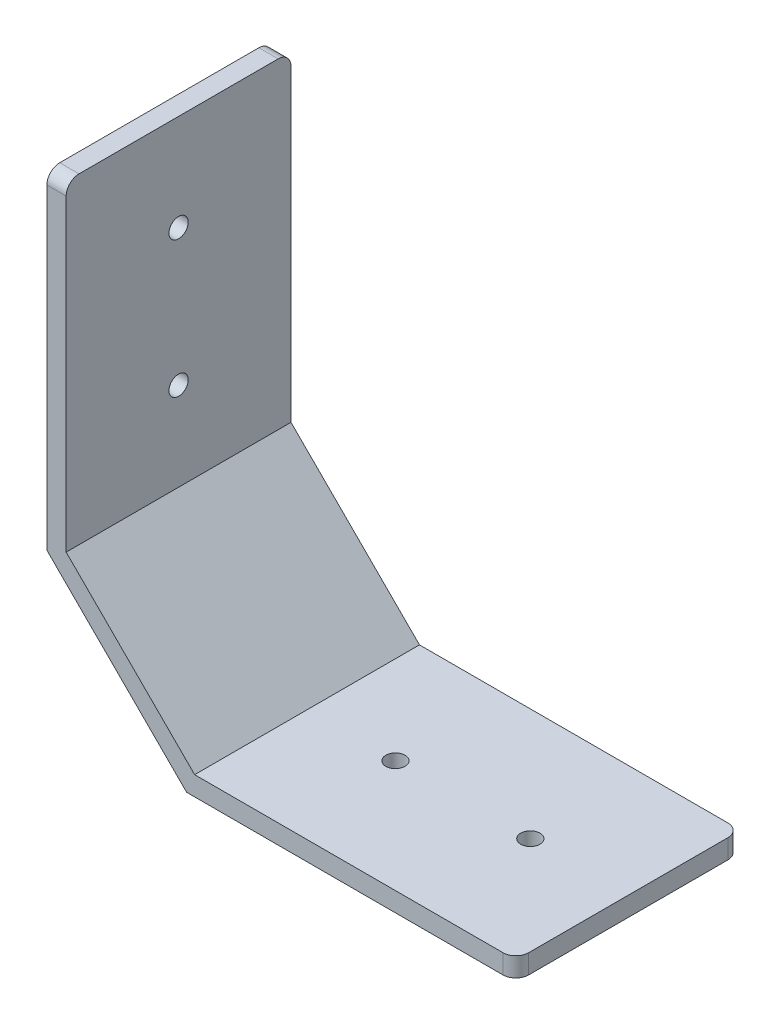
ISO-10303-21;
HEADER;
FILE_DESCRIPTION(('STEP AP214'),'2;1');
FILE_NAME('part.step','',(''),(''),'','','');
FILE_SCHEMA(('AUTOMOTIVE_DESIGN { 1 0 10303 214 1 1 1 1 }'));
ENDSEC;
DATA;
#1=APPLICATION_CONTEXT('core data for automotive mechanical design processes');
#2=APPLICATION_PROTOCOL_DEFINITION('international standard','automotive_design',2000,#1);
#3=PRODUCT_CONTEXT('',#1,'mechanical');
#4=PRODUCT('Part','Part','',(#3));
#5=PRODUCT_RELATED_PRODUCT_CATEGORY('part','',(#4));
#6=PRODUCT_DEFINITION_FORMATION('','',#4);
#7=PRODUCT_DEFINITION_CONTEXT('part definition',#1,'design');
#8=PRODUCT_DEFINITION('design','',#6,#7);
#9=PRODUCT_DEFINITION_SHAPE('','',#8);
#10=(LENGTH_UNIT() NAMED_UNIT(*) SI_UNIT(.MILLI.,.METRE.));
#11=(NAMED_UNIT(*) PLANE_ANGLE_UNIT() SI_UNIT($,.RADIAN.));
#12=(NAMED_UNIT(*) SI_UNIT($,.STERADIAN.) SOLID_ANGLE_UNIT());
#13=UNCERTAINTY_MEASURE_WITH_UNIT(LENGTH_MEASURE(1.E-05),#10,'distance_accuracy_value','');
#14=(GEOMETRIC_REPRESENTATION_CONTEXT(3) GLOBAL_UNCERTAINTY_ASSIGNED_CONTEXT((#13)) GLOBAL_UNIT_ASSIGNED_CONTEXT((#10,
#11,#12)) REPRESENTATION_CONTEXT('',''));
#15=CARTESIAN_POINT('',(0.,0.,0.));
#16=DIRECTION('',(0.,0.,1.));
#17=DIRECTION('',(1.,0.,0.));
#18=AXIS2_PLACEMENT_3D('',#15,#16,#17);
#19=CARTESIAN_POINT('',(20.,-23.,35.));
#20=DIRECTION('',(0.,1.,0.));
#21=DIRECTION('',(0.,0.,1.));
#22=AXIS2_PLACEMENT_3D('',#19,#20,#21);
#23=PLANE('',#22);
#24=CARTESIAN_POINT('',(54.7573593128807,-23.,17.5));
#25=DIRECTION('',(0.,-1.,0.));
#26=DIRECTION('',(0.,0.,-1.));
#27=AXIS2_PLACEMENT_3D('',#24,#25,#26);
#28=CIRCLE('',#27,1.5);
#29=CARTESIAN_POINT('',(54.7573593128807,-23.,16.));
#30=VERTEX_POINT('',#29);
#31=EDGE_CURVE('E226',#30,#30,#28,.T.);
#32=ORIENTED_EDGE('',*,*,#31,.F.);
#33=EDGE_LOOP('',(#32));
#34=FACE_BOUND('',#33,.T.);
#35=CARTESIAN_POINT('',(33.7573593128807,-23.,17.5));
#36=DIRECTION('',(0.,-1.,0.));
#37=DIRECTION('',(0.,0.,-1.));
#38=AXIS2_PLACEMENT_3D('',#35,#36,#37);
#39=CIRCLE('',#38,1.5);
#40=CARTESIAN_POINT('',(33.7573593128807,-23.,16.));
#41=VERTEX_POINT('',#40);
#42=EDGE_CURVE('E218',#41,#41,#39,.T.);
#43=ORIENTED_EDGE('',*,*,#42,.F.);
#44=EDGE_LOOP('',(#43));
#45=FACE_BOUND('',#44,.T.);
#46=DIRECTION('',(1.,0.,0.));
#47=VECTOR('',#46,1.);
#48=CARTESIAN_POINT('',(20.,-23.,0.));
#49=LINE('',#48,#47);
#50=CARTESIAN_POINT('',(18.7573593128807,-23.,0.));
#51=VERTEX_POINT('',#50);
#52=CARTESIAN_POINT('',(68.,-23.,0.));
#53=VERTEX_POINT('',#52);
#54=EDGE_CURVE('E160',#51,#53,#49,.T.);
#55=ORIENTED_EDGE('',*,*,#54,.T.);
#56=CARTESIAN_POINT('',(68.,-23.,2.));
#57=DIRECTION('',(0.,1.,0.));
#58=DIRECTION('',(0.,0.,1.));
#59=AXIS2_PLACEMENT_3D('',#56,#57,#58);
#60=CIRCLE('',#59,2.);
#61=CARTESIAN_POINT('',(70.,-23.,2.));
#62=VERTEX_POINT('',#61);
#63=EDGE_CURVE('E56',#53,#62,#60,.F.);
#64=ORIENTED_EDGE('',*,*,#63,.T.);
#65=DIRECTION('',(0.,0.,-1.));
#66=VECTOR('',#65,1.);
#67=CARTESIAN_POINT('',(70.,-23.,35.));
#68=LINE('',#67,#66);
#69=CARTESIAN_POINT('',(70.,-23.,33.));
#70=VERTEX_POINT('',#69);
#71=EDGE_CURVE('E185',#70,#62,#68,.T.);
#72=ORIENTED_EDGE('',*,*,#71,.F.);
#73=CARTESIAN_POINT('',(68.,-23.,33.));
#74=DIRECTION('',(0.,1.,0.));
#75=DIRECTION('',(0.,0.,1.));
#76=AXIS2_PLACEMENT_3D('',#73,#74,#75);
#77=CIRCLE('',#76,2.);
#78=CARTESIAN_POINT('',(68.,-23.,35.));
#79=VERTEX_POINT('',#78);
#80=EDGE_CURVE('E208',#70,#79,#77,.F.);
#81=ORIENTED_EDGE('',*,*,#80,.T.);
#82=DIRECTION('',(1.,0.,0.));
#83=VECTOR('',#82,1.);
#84=CARTESIAN_POINT('',(20.,-23.,35.));
#85=LINE('',#84,#83);
#86=CARTESIAN_POINT('',(18.7573593128807,-23.,35.));
#87=VERTEX_POINT('',#86);
#88=EDGE_CURVE('E145',#87,#79,#85,.T.);
#89=ORIENTED_EDGE('',*,*,#88,.F.);
#90=DIRECTION('',(0.,0.,-1.));
#91=VECTOR('',#90,1.);
#92=CARTESIAN_POINT('',(18.7573593128807,-23.,35.));
#93=LINE('',#92,#91);
#94=EDGE_CURVE('E159',#87,#51,#93,.T.);
#95=ORIENTED_EDGE('',*,*,#94,.T.);
#96=EDGE_LOOP('',(#55,#64,#72,#81,#89,#95));
#97=FACE_BOUND('',#96,.T.);
#98=ADVANCED_FACE('F32',(#34,#45,#97),#23,.F.);
#99=CARTESIAN_POINT('',(70.,-20.,35.));
#100=DIRECTION('',(1.,0.,0.));
#101=DIRECTION('',(0.,0.,-1.));
#102=AXIS2_PLACEMENT_3D('',#99,#100,#101);
#103=PLANE('',#102);
#104=ORIENTED_EDGE('',*,*,#71,.T.);
#105=DIRECTION('',(0.,-1.,0.));
#106=VECTOR('',#105,1.);
#107=CARTESIAN_POINT('',(70.,-20.,2.));
#108=LINE('',#107,#106);
#109=CARTESIAN_POINT('',(70.,-20.,2.));
#110=VERTEX_POINT('',#109);
#111=EDGE_CURVE('E41',#62,#110,#108,.F.);
#112=ORIENTED_EDGE('',*,*,#111,.T.);
#113=DIRECTION('',(0.,0.,-1.));
#114=VECTOR('',#113,1.);
#115=CARTESIAN_POINT('',(70.,-20.,35.));
#116=LINE('',#115,#114);
#117=CARTESIAN_POINT('',(70.,-20.,33.));
#118=VERTEX_POINT('',#117);
#119=EDGE_CURVE('E134',#118,#110,#116,.T.);
#120=ORIENTED_EDGE('',*,*,#119,.F.);
#121=DIRECTION('',(0.,-1.,0.));
#122=VECTOR('',#121,1.);
#123=CARTESIAN_POINT('',(70.,-23.,33.));
#124=LINE('',#123,#122);
#125=EDGE_CURVE('E205',#118,#70,#124,.T.);
#126=ORIENTED_EDGE('',*,*,#125,.T.);
#127=EDGE_LOOP('',(#104,#112,#120,#126));
#128=FACE_BOUND('',#127,.T.);
#129=ADVANCED_FACE('F236',(#128),#103,.T.);
#130=CARTESIAN_POINT('',(20.,-20.,35.));
#131=DIRECTION('',(0.,1.,0.));
#132=DIRECTION('',(0.,0.,1.));
#133=AXIS2_PLACEMENT_3D('',#130,#131,#132);
#134=PLANE('',#133);
#135=CARTESIAN_POINT('',(54.7573593128807,-20.,17.5));
#136=DIRECTION('',(0.,1.,0.));
#137=DIRECTION('',(0.,0.,1.));
#138=AXIS2_PLACEMENT_3D('',#135,#136,#137);
#139=CIRCLE('',#138,1.5);
#140=CARTESIAN_POINT('',(54.7573593128807,-20.,19.));
#141=VERTEX_POINT('',#140);
#142=EDGE_CURVE('E36',#141,#141,#139,.T.);
#143=ORIENTED_EDGE('',*,*,#142,.F.);
#144=EDGE_LOOP('',(#143));
#145=FACE_BOUND('',#144,.T.);
#146=CARTESIAN_POINT('',(33.7573593128807,-20.,17.5));
#147=DIRECTION('',(0.,1.,0.));
#148=DIRECTION('',(0.,0.,1.));
#149=AXIS2_PLACEMENT_3D('',#146,#147,#148);
#150=CIRCLE('',#149,1.5);
#151=CARTESIAN_POINT('',(33.7573593128807,-20.,19.));
#152=VERTEX_POINT('',#151);
#153=EDGE_CURVE('E162',#152,#152,#150,.T.);
#154=ORIENTED_EDGE('',*,*,#153,.F.);
#155=EDGE_LOOP('',(#154));
#156=FACE_BOUND('',#155,.T.);
#157=ORIENTED_EDGE('',*,*,#119,.T.);
#158=CARTESIAN_POINT('',(68.,-20.,2.));
#159=DIRECTION('',(0.,1.,0.));
#160=DIRECTION('',(0.,0.,1.));
#161=AXIS2_PLACEMENT_3D('',#158,#159,#160);
#162=CIRCLE('',#161,2.);
#163=CARTESIAN_POINT('',(68.,-20.,0.));
#164=VERTEX_POINT('',#163);
#165=EDGE_CURVE('E11',#110,#164,#162,.T.);
#166=ORIENTED_EDGE('',*,*,#165,.T.);
#167=DIRECTION('',(1.,0.,0.));
#168=VECTOR('',#167,1.);
#169=CARTESIAN_POINT('',(20.,-20.,0.));
#170=LINE('',#169,#168);
#171=CARTESIAN_POINT('',(20.,-20.,0.));
#172=VERTEX_POINT('',#171);
#173=EDGE_CURVE('E129',#172,#164,#170,.T.);
#174=ORIENTED_EDGE('',*,*,#173,.F.);
#175=DIRECTION('',(0.,0.,-1.));
#176=VECTOR('',#175,1.);
#177=CARTESIAN_POINT('',(20.,-20.,35.));
#178=LINE('',#177,#176);
#179=CARTESIAN_POINT('',(20.,-20.,35.));
#180=VERTEX_POINT('',#179);
#181=EDGE_CURVE('E123',#180,#172,#178,.T.);
#182=ORIENTED_EDGE('',*,*,#181,.F.);
#183=DIRECTION('',(1.,0.,0.));
#184=VECTOR('',#183,1.);
#185=CARTESIAN_POINT('',(20.,-20.,35.));
#186=LINE('',#185,#184);
#187=CARTESIAN_POINT('',(68.,-20.,35.));
#188=VERTEX_POINT('',#187);
#189=EDGE_CURVE('E126',#180,#188,#186,.T.);
#190=ORIENTED_EDGE('',*,*,#189,.T.);
#191=CARTESIAN_POINT('',(68.,-20.,33.));
#192=DIRECTION('',(0.,1.,0.));
#193=DIRECTION('',(0.,0.,1.));
#194=AXIS2_PLACEMENT_3D('',#191,#192,#193);
#195=CIRCLE('',#194,2.);
#196=EDGE_CURVE('E211',#188,#118,#195,.T.);
#197=ORIENTED_EDGE('',*,*,#196,.T.);
#198=EDGE_LOOP('',(#157,#166,#174,#182,#190,#197));
#199=FACE_BOUND('',#198,.T.);
#200=ADVANCED_FACE('F125',(#145,#156,#199),#134,.T.);
#201=CARTESIAN_POINT('',(0.,0.,35.));
#202=DIRECTION('',(0.707106781186548,0.707106781186548,0.));
#203=DIRECTION('',(-0.707106781186548,0.707106781186547,0.));
#204=AXIS2_PLACEMENT_3D('',#201,#202,#203);
#205=PLANE('',#204);
#206=DIRECTION('',(0.707106781186548,-0.707106781186547,0.));
#207=VECTOR('',#206,1.);
#208=CARTESIAN_POINT('',(0.,0.,0.));
#209=LINE('',#208,#207);
#210=CARTESIAN_POINT('',(0.,0.,0.));
#211=VERTEX_POINT('',#210);
#212=EDGE_CURVE('E164',#211,#172,#209,.T.);
#213=ORIENTED_EDGE('',*,*,#212,.F.);
#214=DIRECTION('',(0.,0.,-1.));
#215=VECTOR('',#214,1.);
#216=CARTESIAN_POINT('',(0.,0.,35.));
#217=LINE('',#216,#215);
#218=CARTESIAN_POINT('',(0.,0.,35.));
#219=VERTEX_POINT('',#218);
#220=EDGE_CURVE('E135',#219,#211,#217,.T.);
#221=ORIENTED_EDGE('',*,*,#220,.F.);
#222=DIRECTION('',(0.707106781186548,-0.707106781186547,0.));
#223=VECTOR('',#222,1.);
#224=CARTESIAN_POINT('',(0.,0.,35.));
#225=LINE('',#224,#223);
#226=EDGE_CURVE('E142',#219,#180,#225,.T.);
#227=ORIENTED_EDGE('',*,*,#226,.T.);
#228=ORIENTED_EDGE('',*,*,#181,.T.);
#229=EDGE_LOOP('',(#213,#221,#227,#228));
#230=FACE_BOUND('',#229,.T.);
#231=ADVANCED_FACE('F148',(#230),#205,.T.);
#232=CARTESIAN_POINT('',(0.,0.,35.));
#233=DIRECTION('',(1.,0.,0.));
#234=DIRECTION('',(0.,0.,-1.));
#235=AXIS2_PLACEMENT_3D('',#232,#233,#234);
#236=PLANE('',#235);
#237=CARTESIAN_POINT('',(0.,13.7573593128807,17.5));
#238=DIRECTION('',(1.,0.,0.));
#239=DIRECTION('',(0.,0.,-1.));
#240=AXIS2_PLACEMENT_3D('',#237,#238,#239);
#241=CIRCLE('',#240,1.5);
#242=CARTESIAN_POINT('',(0.,13.7573593128807,16.));
#243=VERTEX_POINT('',#242);
#244=EDGE_CURVE('E326',#243,#243,#241,.T.);
#245=ORIENTED_EDGE('',*,*,#244,.F.);
#246=EDGE_LOOP('',(#245));
#247=FACE_BOUND('',#246,.T.);
#248=CARTESIAN_POINT('',(0.,35.,17.5));
#249=DIRECTION('',(1.,0.,0.));
#250=DIRECTION('',(0.,0.,-1.));
#251=AXIS2_PLACEMENT_3D('',#248,#249,#250);
#252=CIRCLE('',#251,1.5);
#253=CARTESIAN_POINT('',(0.,35.,16.));
#254=VERTEX_POINT('',#253);
#255=EDGE_CURVE('E320',#254,#254,#252,.T.);
#256=ORIENTED_EDGE('',*,*,#255,.F.);
#257=EDGE_LOOP('',(#256));
#258=FACE_BOUND('',#257,.T.);
#259=DIRECTION('',(0.,-1.,0.));
#260=VECTOR('',#259,1.);
#261=CARTESIAN_POINT('',(0.,0.,0.));
#262=LINE('',#261,#260);
#263=CARTESIAN_POINT('',(0.,48.,0.));
#264=VERTEX_POINT('',#263);
#265=EDGE_CURVE('E166',#264,#211,#262,.T.);
#266=ORIENTED_EDGE('',*,*,#265,.F.);
#267=CARTESIAN_POINT('',(0.,48.,2.));
#268=DIRECTION('',(1.,0.,0.));
#269=DIRECTION('',(0.,0.,-1.));
#270=AXIS2_PLACEMENT_3D('',#267,#268,#269);
#271=CIRCLE('',#270,2.);
#272=CARTESIAN_POINT('',(0.,50.,2.));
#273=VERTEX_POINT('',#272);
#274=EDGE_CURVE('E199',#264,#273,#271,.T.);
#275=ORIENTED_EDGE('',*,*,#274,.T.);
#276=DIRECTION('',(0.,0.,-1.));
#277=VECTOR('',#276,1.);
#278=CARTESIAN_POINT('',(0.,50.,35.));
#279=LINE('',#278,#277);
#280=CARTESIAN_POINT('',(0.,50.,33.));
#281=VERTEX_POINT('',#280);
#282=EDGE_CURVE('E180',#281,#273,#279,.T.);
#283=ORIENTED_EDGE('',*,*,#282,.F.);
#284=CARTESIAN_POINT('',(0.,48.,33.));
#285=DIRECTION('',(1.,0.,0.));
#286=DIRECTION('',(0.,0.,-1.));
#287=AXIS2_PLACEMENT_3D('',#284,#285,#286);
#288=CIRCLE('',#287,2.);
#289=CARTESIAN_POINT('',(0.,48.,35.));
#290=VERTEX_POINT('',#289);
#291=EDGE_CURVE('E190',#281,#290,#288,.T.);
#292=ORIENTED_EDGE('',*,*,#291,.T.);
#293=DIRECTION('',(0.,-1.,0.));
#294=VECTOR('',#293,1.);
#295=CARTESIAN_POINT('',(0.,0.,35.));
#296=LINE('',#295,#294);
#297=EDGE_CURVE('E150',#290,#219,#296,.T.);
#298=ORIENTED_EDGE('',*,*,#297,.T.);
#299=ORIENTED_EDGE('',*,*,#220,.T.);
#300=EDGE_LOOP('',(#266,#275,#283,#292,#298,#299));
#301=FACE_BOUND('',#300,.T.);
#302=ADVANCED_FACE('F274',(#247,#258,#301),#236,.T.);
#303=CARTESIAN_POINT('',(-3.,50.,35.));
#304=DIRECTION('',(0.,1.,0.));
#305=DIRECTION('',(0.,0.,1.));
#306=AXIS2_PLACEMENT_3D('',#303,#304,#305);
#307=PLANE('',#306);
#308=ORIENTED_EDGE('',*,*,#282,.T.);
#309=DIRECTION('',(1.,0.,0.));
#310=VECTOR('',#309,1.);
#311=CARTESIAN_POINT('',(-3.,50.,2.));
#312=LINE('',#311,#310);
#313=CARTESIAN_POINT('',(-3.,50.,2.));
#314=VERTEX_POINT('',#313);
#315=EDGE_CURVE('E201',#273,#314,#312,.F.);
#316=ORIENTED_EDGE('',*,*,#315,.T.);
#317=DIRECTION('',(0.,0.,-1.));
#318=VECTOR('',#317,1.);
#319=CARTESIAN_POINT('',(-3.,50.,35.));
#320=LINE('',#319,#318);
#321=CARTESIAN_POINT('',(-3.,50.,33.));
#322=VERTEX_POINT('',#321);
#323=EDGE_CURVE('E177',#322,#314,#320,.T.);
#324=ORIENTED_EDGE('',*,*,#323,.F.);
#325=DIRECTION('',(1.,0.,0.));
#326=VECTOR('',#325,1.);
#327=CARTESIAN_POINT('',(0.,50.,33.));
#328=LINE('',#327,#326);
#329=EDGE_CURVE('E187',#322,#281,#328,.T.);
#330=ORIENTED_EDGE('',*,*,#329,.T.);
#331=EDGE_LOOP('',(#308,#316,#324,#330));
#332=FACE_BOUND('',#331,.T.);
#333=ADVANCED_FACE('F286',(#332),#307,.T.);
#334=CARTESIAN_POINT('',(-3.,0.,35.));
#335=DIRECTION('',(1.,0.,0.));
#336=DIRECTION('',(0.,0.,-1.));
#337=AXIS2_PLACEMENT_3D('',#334,#335,#336);
#338=PLANE('',#337);
#339=CARTESIAN_POINT('',(-3.,13.7573593128807,17.5));
#340=DIRECTION('',(-1.,0.,0.));
#341=DIRECTION('',(0.,0.,1.));
#342=AXIS2_PLACEMENT_3D('',#339,#340,#341);
#343=CIRCLE('',#342,1.5);
#344=CARTESIAN_POINT('',(-3.,13.7573593128807,19.));
#345=VERTEX_POINT('',#344);
#346=EDGE_CURVE('E331',#345,#345,#343,.T.);
#347=ORIENTED_EDGE('',*,*,#346,.F.);
#348=EDGE_LOOP('',(#347));
#349=FACE_BOUND('',#348,.T.);
#350=CARTESIAN_POINT('',(-3.,35.,17.5));
#351=DIRECTION('',(-1.,0.,0.));
#352=DIRECTION('',(0.,0.,1.));
#353=AXIS2_PLACEMENT_3D('',#350,#351,#352);
#354=CIRCLE('',#353,1.5);
#355=CARTESIAN_POINT('',(-3.,35.,19.));
#356=VERTEX_POINT('',#355);
#357=EDGE_CURVE('E322',#356,#356,#354,.T.);
#358=ORIENTED_EDGE('',*,*,#357,.F.);
#359=EDGE_LOOP('',(#358));
#360=FACE_BOUND('',#359,.T.);
#361=ORIENTED_EDGE('',*,*,#323,.T.);
#362=CARTESIAN_POINT('',(-3.,48.,2.));
#363=DIRECTION('',(1.,0.,0.));
#364=DIRECTION('',(0.,0.,-1.));
#365=AXIS2_PLACEMENT_3D('',#362,#363,#364);
#366=CIRCLE('',#365,2.);
#367=CARTESIAN_POINT('',(-3.,48.,0.));
#368=VERTEX_POINT('',#367);
#369=EDGE_CURVE('E203',#314,#368,#366,.F.);
#370=ORIENTED_EDGE('',*,*,#369,.T.);
#371=DIRECTION('',(0.,1.,0.));
#372=VECTOR('',#371,1.);
#373=CARTESIAN_POINT('',(-3.,0.,0.));
#374=LINE('',#373,#372);
#375=CARTESIAN_POINT('',(-3.,-1.24264068711929,0.));
#376=VERTEX_POINT('',#375);
#377=EDGE_CURVE('E168',#368,#376,#374,.F.);
#378=ORIENTED_EDGE('',*,*,#377,.T.);
#379=DIRECTION('',(0.,0.,-1.));
#380=VECTOR('',#379,1.);
#381=CARTESIAN_POINT('',(-3.,-1.24264068711929,35.));
#382=LINE('',#381,#380);
#383=CARTESIAN_POINT('',(-3.,-1.24264068711929,35.));
#384=VERTEX_POINT('',#383);
#385=EDGE_CURVE('E174',#384,#376,#382,.T.);
#386=ORIENTED_EDGE('',*,*,#385,.F.);
#387=DIRECTION('',(0.,1.,0.));
#388=VECTOR('',#387,1.);
#389=CARTESIAN_POINT('',(-3.,0.,35.));
#390=LINE('',#389,#388);
#391=CARTESIAN_POINT('',(-3.,48.,35.));
#392=VERTEX_POINT('',#391);
#393=EDGE_CURVE('E152',#392,#384,#390,.F.);
#394=ORIENTED_EDGE('',*,*,#393,.F.);
#395=CARTESIAN_POINT('',(-3.,48.,33.));
#396=DIRECTION('',(1.,0.,0.));
#397=DIRECTION('',(0.,0.,-1.));
#398=AXIS2_PLACEMENT_3D('',#395,#396,#397);
#399=CIRCLE('',#398,2.);
#400=EDGE_CURVE('E194',#392,#322,#399,.F.);
#401=ORIENTED_EDGE('',*,*,#400,.T.);
#402=EDGE_LOOP('',(#361,#370,#378,#386,#394,#401));
#403=FACE_BOUND('',#402,.T.);
#404=ADVANCED_FACE('F282',(#349,#360,#403),#338,.F.);
#405=CARTESIAN_POINT('',(-2.12132034355964,-2.12132034355964,35.));
#406=DIRECTION('',(0.707106781186548,0.707106781186548,0.));
#407=DIRECTION('',(-0.707106781186548,0.707106781186547,0.));
#408=AXIS2_PLACEMENT_3D('',#405,#406,#407);
#409=PLANE('',#408);
#410=DIRECTION('',(0.707106781186548,-0.707106781186547,0.));
#411=VECTOR('',#410,1.);
#412=CARTESIAN_POINT('',(-2.12132034355964,-2.12132034355964,0.));
#413=LINE('',#412,#411);
#414=EDGE_CURVE('E170',#376,#51,#413,.T.);
#415=ORIENTED_EDGE('',*,*,#414,.T.);
#416=ORIENTED_EDGE('',*,*,#94,.F.);
#417=DIRECTION('',(0.707106781186548,-0.707106781186547,0.));
#418=VECTOR('',#417,1.);
#419=CARTESIAN_POINT('',(-2.12132034355964,-2.12132034355964,35.));
#420=LINE('',#419,#418);
#421=EDGE_CURVE('E157',#384,#87,#420,.T.);
#422=ORIENTED_EDGE('',*,*,#421,.F.);
#423=ORIENTED_EDGE('',*,*,#385,.T.);
#424=EDGE_LOOP('',(#415,#416,#422,#423));
#425=FACE_BOUND('',#424,.T.);
#426=ADVANCED_FACE('F290',(#425),#409,.F.);
#427=CARTESIAN_POINT('',(0.,0.,35.));
#428=DIRECTION('',(0.,0.,-1.));
#429=DIRECTION('',(-1.,0.,0.));
#430=AXIS2_PLACEMENT_3D('',#427,#428,#429);
#431=PLANE('',#430);
#432=ORIENTED_EDGE('',*,*,#88,.T.);
#433=DIRECTION('',(0.,-1.,0.));
#434=VECTOR('',#433,1.);
#435=CARTESIAN_POINT('',(68.,-20.,35.));
#436=LINE('',#435,#434);
#437=EDGE_CURVE('E144',#79,#188,#436,.F.);
#438=ORIENTED_EDGE('',*,*,#437,.T.);
#439=ORIENTED_EDGE('',*,*,#189,.F.);
#440=ORIENTED_EDGE('',*,*,#226,.F.);
#441=ORIENTED_EDGE('',*,*,#297,.F.);
#442=DIRECTION('',(1.,0.,0.));
#443=VECTOR('',#442,1.);
#444=CARTESIAN_POINT('',(-3.,48.,35.));
#445=LINE('',#444,#443);
#446=EDGE_CURVE('E192',#290,#392,#445,.F.);
#447=ORIENTED_EDGE('',*,*,#446,.T.);
#448=ORIENTED_EDGE('',*,*,#393,.T.);
#449=ORIENTED_EDGE('',*,*,#421,.T.);
#450=EDGE_LOOP('',(#432,#438,#439,#440,#441,#447,#448,#449));
#451=FACE_BOUND('',#450,.T.);
#452=ADVANCED_FACE('F140',(#451),#431,.F.);
#453=CARTESIAN_POINT('',(0.,0.,0.));
#454=DIRECTION('',(0.,0.,-1.));
#455=DIRECTION('',(-1.,0.,0.));
#456=AXIS2_PLACEMENT_3D('',#453,#454,#455);
#457=PLANE('',#456);
#458=ORIENTED_EDGE('',*,*,#173,.T.);
#459=DIRECTION('',(0.,-1.,0.));
#460=VECTOR('',#459,1.);
#461=CARTESIAN_POINT('',(68.,0.,0.));
#462=LINE('',#461,#460);
#463=EDGE_CURVE('E213',#164,#53,#462,.T.);
#464=ORIENTED_EDGE('',*,*,#463,.T.);
#465=ORIENTED_EDGE('',*,*,#54,.F.);
#466=ORIENTED_EDGE('',*,*,#414,.F.);
#467=ORIENTED_EDGE('',*,*,#377,.F.);
#468=DIRECTION('',(1.,0.,0.));
#469=VECTOR('',#468,1.);
#470=CARTESIAN_POINT('',(0.,48.,0.));
#471=LINE('',#470,#469);
#472=EDGE_CURVE('E196',#368,#264,#471,.T.);
#473=ORIENTED_EDGE('',*,*,#472,.T.);
#474=ORIENTED_EDGE('',*,*,#265,.T.);
#475=ORIENTED_EDGE('',*,*,#212,.T.);
#476=EDGE_LOOP('',(#458,#464,#465,#466,#467,#473,#474,#475));
#477=FACE_BOUND('',#476,.T.);
#478=ADVANCED_FACE('F253',(#477),#457,.T.);
#479=CARTESIAN_POINT('',(-3.,48.,33.));
#480=DIRECTION('',(-1.,0.,0.));
#481=DIRECTION('',(0.,0.,1.));
#482=AXIS2_PLACEMENT_3D('',#479,#480,#481);
#483=CYLINDRICAL_SURFACE('',#482,2.);
#484=ORIENTED_EDGE('',*,*,#400,.F.);
#485=ORIENTED_EDGE('',*,*,#446,.F.);
#486=ORIENTED_EDGE('',*,*,#291,.F.);
#487=ORIENTED_EDGE('',*,*,#329,.F.);
#488=EDGE_LOOP('',(#484,#485,#486,#487));
#489=FACE_BOUND('',#488,.T.);
#490=ADVANCED_FACE('F249',(#489),#483,.T.);
#491=CARTESIAN_POINT('',(0.,48.,2.));
#492=DIRECTION('',(1.,0.,0.));
#493=DIRECTION('',(0.,0.,-1.));
#494=AXIS2_PLACEMENT_3D('',#491,#492,#493);
#495=CYLINDRICAL_SURFACE('',#494,2.);
#496=ORIENTED_EDGE('',*,*,#369,.F.);
#497=ORIENTED_EDGE('',*,*,#315,.F.);
#498=ORIENTED_EDGE('',*,*,#274,.F.);
#499=ORIENTED_EDGE('',*,*,#472,.F.);
#500=EDGE_LOOP('',(#496,#497,#498,#499));
#501=FACE_BOUND('',#500,.T.);
#502=ADVANCED_FACE('F252',(#501),#495,.T.);
#503=CARTESIAN_POINT('',(68.,-20.,33.));
#504=DIRECTION('',(0.,1.,0.));
#505=DIRECTION('',(0.,0.,1.));
#506=AXIS2_PLACEMENT_3D('',#503,#504,#505);
#507=CYLINDRICAL_SURFACE('',#506,2.);
#508=ORIENTED_EDGE('',*,*,#196,.F.);
#509=ORIENTED_EDGE('',*,*,#437,.F.);
#510=ORIENTED_EDGE('',*,*,#80,.F.);
#511=ORIENTED_EDGE('',*,*,#125,.F.);
#512=EDGE_LOOP('',(#508,#509,#510,#511));
#513=FACE_BOUND('',#512,.T.);
#514=ADVANCED_FACE('F233',(#513),#507,.T.);
#515=CARTESIAN_POINT('',(68.,0.,2.));
#516=DIRECTION('',(0.,-1.,0.));
#517=DIRECTION('',(0.,0.,-1.));
#518=AXIS2_PLACEMENT_3D('',#515,#516,#517);
#519=CYLINDRICAL_SURFACE('',#518,2.);
#520=ORIENTED_EDGE('',*,*,#165,.F.);
#521=ORIENTED_EDGE('',*,*,#111,.F.);
#522=ORIENTED_EDGE('',*,*,#63,.F.);
#523=ORIENTED_EDGE('',*,*,#463,.F.);
#524=EDGE_LOOP('',(#520,#521,#522,#523));
#525=FACE_BOUND('',#524,.T.);
#526=ADVANCED_FACE('F34',(#525),#519,.T.);
#527=CARTESIAN_POINT('',(33.7573593128807,-13.,17.5));
#528=DIRECTION('',(0.,-1.,0.));
#529=DIRECTION('',(0.,0.,-1.));
#530=AXIS2_PLACEMENT_3D('',#527,#528,#529);
#531=CYLINDRICAL_SURFACE('',#530,1.5);
#532=ORIENTED_EDGE('',*,*,#153,.T.);
#533=EDGE_LOOP('',(#532));
#534=FACE_BOUND('',#533,.T.);
#535=ORIENTED_EDGE('',*,*,#42,.T.);
#536=EDGE_LOOP('',(#535));
#537=FACE_BOUND('',#536,.T.);
#538=ADVANCED_FACE('F261',(#534,#537),#531,.F.);
#539=CARTESIAN_POINT('',(54.7573593128807,-13.,17.5));
#540=DIRECTION('',(0.,-1.,0.));
#541=DIRECTION('',(0.,0.,-1.));
#542=AXIS2_PLACEMENT_3D('',#539,#540,#541);
#543=CYLINDRICAL_SURFACE('',#542,1.5);
#544=ORIENTED_EDGE('',*,*,#142,.T.);
#545=EDGE_LOOP('',(#544));
#546=FACE_BOUND('',#545,.T.);
#547=ORIENTED_EDGE('',*,*,#31,.T.);
#548=EDGE_LOOP('',(#547));
#549=FACE_BOUND('',#548,.T.);
#550=ADVANCED_FACE('F266',(#546,#549),#543,.F.);
#551=CARTESIAN_POINT('',(7.,35.,17.5));
#552=DIRECTION('',(-1.,0.,0.));
#553=DIRECTION('',(0.,0.,1.));
#554=AXIS2_PLACEMENT_3D('',#551,#552,#553);
#555=CYLINDRICAL_SURFACE('',#554,1.5);
#556=ORIENTED_EDGE('',*,*,#255,.T.);
#557=EDGE_LOOP('',(#556));
#558=FACE_BOUND('',#557,.T.);
#559=ORIENTED_EDGE('',*,*,#357,.T.);
#560=EDGE_LOOP('',(#559));
#561=FACE_BOUND('',#560,.T.);
#562=ADVANCED_FACE('F317',(#558,#561),#555,.F.);
#563=CARTESIAN_POINT('',(7.,13.7573593128807,17.5));
#564=DIRECTION('',(-1.,0.,0.));
#565=DIRECTION('',(0.,0.,1.));
#566=AXIS2_PLACEMENT_3D('',#563,#564,#565);
#567=CYLINDRICAL_SURFACE('',#566,1.5);
#568=ORIENTED_EDGE('',*,*,#244,.T.);
#569=EDGE_LOOP('',(#568));
#570=FACE_BOUND('',#569,.T.);
#571=ORIENTED_EDGE('',*,*,#346,.T.);
#572=EDGE_LOOP('',(#571));
#573=FACE_BOUND('',#572,.T.);
#574=ADVANCED_FACE('F335',(#570,#573),#567,.F.);
#575=CLOSED_SHELL('',(#98,#129,#200,#231,#302,#333,#404,#426,#452,#478,#490,#502,#514,#526,#538,
#550,#562,#574));
#576=MANIFOLD_SOLID_BREP('B2',#575);
#577=ADVANCED_BREP_SHAPE_REPRESENTATION('',(#18,#576),#14);
#578=SHAPE_DEFINITION_REPRESENTATION(#9,#577);
ENDSEC;
END-ISO-10303-21;
